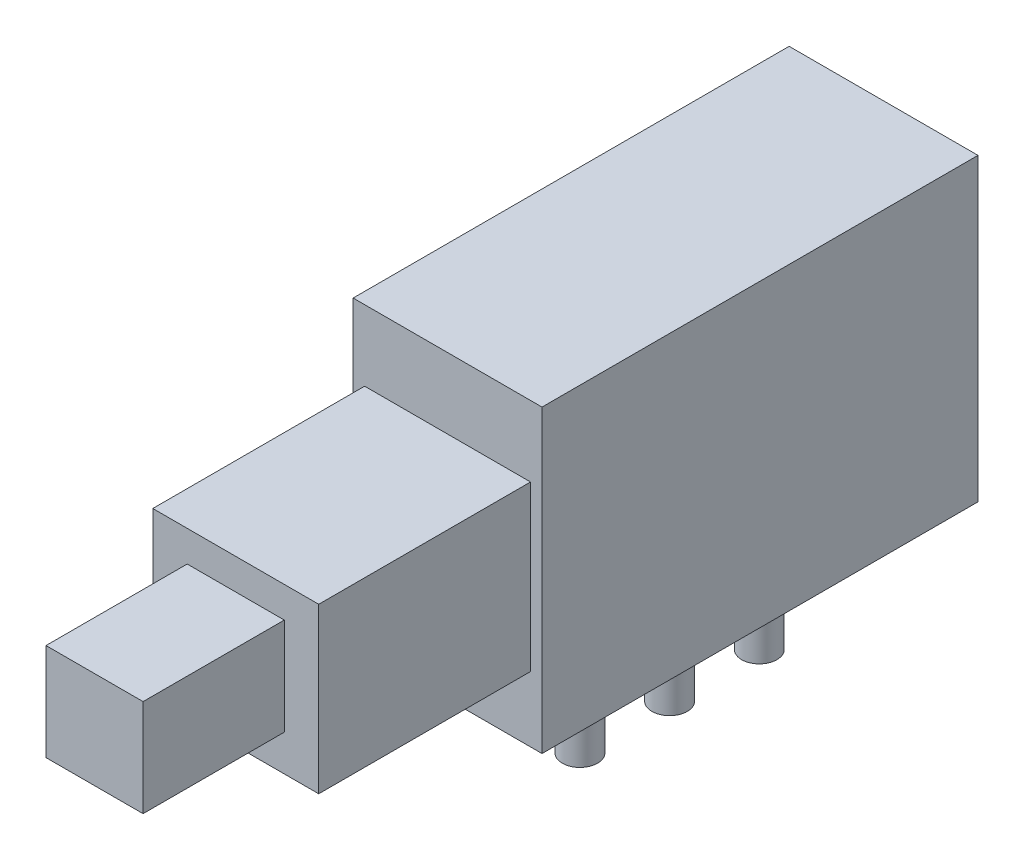
ISO-10303-21;
HEADER;
FILE_DESCRIPTION(('STEP AP214'),'2;1');
FILE_NAME('part.step','',(''),(''),'','','');
FILE_SCHEMA(('AUTOMOTIVE_DESIGN { 1 0 10303 214 1 1 1 1 }'));
ENDSEC;
DATA;
#1=APPLICATION_CONTEXT('core data for automotive mechanical design processes');
#2=APPLICATION_PROTOCOL_DEFINITION('international standard','automotive_design',2000,#1);
#3=PRODUCT_CONTEXT('',#1,'mechanical');
#4=PRODUCT('Part','Part','',(#3));
#5=PRODUCT_RELATED_PRODUCT_CATEGORY('part','',(#4));
#6=PRODUCT_DEFINITION_FORMATION('','',#4);
#7=PRODUCT_DEFINITION_CONTEXT('part definition',#1,'design');
#8=PRODUCT_DEFINITION('design','',#6,#7);
#9=PRODUCT_DEFINITION_SHAPE('','',#8);
#10=(LENGTH_UNIT() NAMED_UNIT(*) SI_UNIT(.MILLI.,.METRE.));
#11=(NAMED_UNIT(*) PLANE_ANGLE_UNIT() SI_UNIT($,.RADIAN.));
#12=(NAMED_UNIT(*) SI_UNIT($,.STERADIAN.) SOLID_ANGLE_UNIT());
#13=UNCERTAINTY_MEASURE_WITH_UNIT(LENGTH_MEASURE(1.E-05),#10,'distance_accuracy_value','');
#14=(GEOMETRIC_REPRESENTATION_CONTEXT(3) GLOBAL_UNCERTAINTY_ASSIGNED_CONTEXT((#13)) GLOBAL_UNIT_ASSIGNED_CONTEXT((#10,
#11,#12)) REPRESENTATION_CONTEXT('',''));
#15=CARTESIAN_POINT('',(0.,0.,0.));
#16=DIRECTION('',(0.,0.,1.));
#17=DIRECTION('',(1.,0.,0.));
#18=AXIS2_PLACEMENT_3D('',#15,#16,#17);
#19=CARTESIAN_POINT('',(0.,0.,12.35));
#20=DIRECTION('',(0.,0.,-1.));
#21=DIRECTION('',(-1.,0.,0.));
#22=AXIS2_PLACEMENT_3D('',#19,#20,#21);
#23=PLANE('',#22);
#24=DIRECTION('',(0.,1.,0.));
#25=VECTOR('',#24,1.);
#26=CARTESIAN_POINT('',(-2.675,-4.25,12.35));
#27=LINE('',#26,#25);
#28=CARTESIAN_POINT('',(-2.675,-4.25,12.35));
#29=VERTEX_POINT('',#28);
#30=CARTESIAN_POINT('',(-2.675,4.25,12.35));
#31=VERTEX_POINT('',#30);
#32=EDGE_CURVE('E180',#29,#31,#27,.T.);
#33=ORIENTED_EDGE('',*,*,#32,.F.);
#34=DIRECTION('',(1.,0.,0.));
#35=VECTOR('',#34,1.);
#36=CARTESIAN_POINT('',(-2.675,-4.25,12.35));
#37=LINE('',#36,#35);
#38=CARTESIAN_POINT('',(2.675,-4.25,12.35));
#39=VERTEX_POINT('',#38);
#40=EDGE_CURVE('E189',#29,#39,#37,.T.);
#41=ORIENTED_EDGE('',*,*,#40,.T.);
#42=DIRECTION('',(0.,1.,0.));
#43=VECTOR('',#42,1.);
#44=CARTESIAN_POINT('',(2.675,-4.25,12.35));
#45=LINE('',#44,#43);
#46=CARTESIAN_POINT('',(2.675,4.25,12.35));
#47=VERTEX_POINT('',#46);
#48=EDGE_CURVE('E187',#39,#47,#45,.T.);
#49=ORIENTED_EDGE('',*,*,#48,.T.);
#50=DIRECTION('',(1.,0.,0.));
#51=VECTOR('',#50,1.);
#52=CARTESIAN_POINT('',(-2.675,4.25,12.35));
#53=LINE('',#52,#51);
#54=EDGE_CURVE('E183',#31,#47,#53,.T.);
#55=ORIENTED_EDGE('',*,*,#54,.F.);
#56=EDGE_LOOP('',(#33,#41,#49,#55));
#57=FACE_BOUND('',#56,.T.);
#58=DIRECTION('',(0.,-1.,0.));
#59=VECTOR('',#58,1.);
#60=CARTESIAN_POINT('',(-2.35,2.25,12.35));
#61=LINE('',#60,#59);
#62=CARTESIAN_POINT('',(-2.35,2.25,12.35));
#63=VERTEX_POINT('',#62);
#64=CARTESIAN_POINT('',(-2.35,-2.4,12.35));
#65=VERTEX_POINT('',#64);
#66=EDGE_CURVE('E147',#63,#65,#61,.T.);
#67=ORIENTED_EDGE('',*,*,#66,.F.);
#68=DIRECTION('',(1.,0.,0.));
#69=VECTOR('',#68,1.);
#70=CARTESIAN_POINT('',(-2.35,2.25,12.35));
#71=LINE('',#70,#69);
#72=CARTESIAN_POINT('',(2.35,2.25,12.35));
#73=VERTEX_POINT('',#72);
#74=EDGE_CURVE('E143',#63,#73,#71,.T.);
#75=ORIENTED_EDGE('',*,*,#74,.T.);
#76=DIRECTION('',(0.,-1.,0.));
#77=VECTOR('',#76,1.);
#78=CARTESIAN_POINT('',(2.35,2.25,12.35));
#79=LINE('',#78,#77);
#80=CARTESIAN_POINT('',(2.35,-2.4,12.35));
#81=VERTEX_POINT('',#80);
#82=EDGE_CURVE('E49',#73,#81,#79,.T.);
#83=ORIENTED_EDGE('',*,*,#82,.T.);
#84=DIRECTION('',(1.,0.,0.));
#85=VECTOR('',#84,1.);
#86=CARTESIAN_POINT('',(-2.35,-2.4,12.35));
#87=LINE('',#86,#85);
#88=EDGE_CURVE('E456',#65,#81,#87,.T.);
#89=ORIENTED_EDGE('',*,*,#88,.F.);
#90=EDGE_LOOP('',(#67,#75,#83,#89));
#91=FACE_BOUND('',#90,.T.);
#92=ADVANCED_FACE('F34',(#57,#91),#23,.F.);
#93=CARTESIAN_POINT('',(-2.675,-4.25,12.35));
#94=DIRECTION('',(-1.,0.,0.));
#95=DIRECTION('',(0.,0.,1.));
#96=AXIS2_PLACEMENT_3D('',#93,#94,#95);
#97=PLANE('',#96);
#98=DIRECTION('',(0.,1.,0.));
#99=VECTOR('',#98,1.);
#100=CARTESIAN_POINT('',(-2.675,-4.25,0.));
#101=LINE('',#100,#99);
#102=CARTESIAN_POINT('',(-2.675,-4.25,0.));
#103=VERTEX_POINT('',#102);
#104=CARTESIAN_POINT('',(-2.675,4.25,0.));
#105=VERTEX_POINT('',#104);
#106=EDGE_CURVE('E173',#103,#105,#101,.T.);
#107=ORIENTED_EDGE('',*,*,#106,.F.);
#108=DIRECTION('',(0.,0.,-1.));
#109=VECTOR('',#108,1.);
#110=CARTESIAN_POINT('',(-2.675,-4.25,12.35));
#111=LINE('',#110,#109);
#112=EDGE_CURVE('E201',#29,#103,#111,.T.);
#113=ORIENTED_EDGE('',*,*,#112,.F.);
#114=ORIENTED_EDGE('',*,*,#32,.T.);
#115=DIRECTION('',(0.,0.,-1.));
#116=VECTOR('',#115,1.);
#117=CARTESIAN_POINT('',(-2.675,4.25,12.35));
#118=LINE('',#117,#116);
#119=EDGE_CURVE('E191',#31,#105,#118,.T.);
#120=ORIENTED_EDGE('',*,*,#119,.T.);
#121=EDGE_LOOP('',(#107,#113,#114,#120));
#122=FACE_BOUND('',#121,.T.);
#123=ADVANCED_FACE('F36',(#122),#97,.T.);
#124=CARTESIAN_POINT('',(-2.675,-4.25,12.35));
#125=DIRECTION('',(0.,1.,0.));
#126=DIRECTION('',(0.,0.,1.));
#127=AXIS2_PLACEMENT_3D('',#124,#125,#126);
#128=PLANE('',#127);
#129=CARTESIAN_POINT('',(0.,-4.25,3.52));
#130=DIRECTION('',(0.,1.,0.));
#131=DIRECTION('',(0.,0.,1.));
#132=AXIS2_PLACEMENT_3D('',#129,#130,#131);
#133=CIRCLE('',#132,0.500000000000001);
#134=CARTESIAN_POINT('',(0.,-4.25,4.02));
#135=VERTEX_POINT('',#134);
#136=EDGE_CURVE('E11',#135,#135,#133,.F.);
#137=ORIENTED_EDGE('',*,*,#136,.F.);
#138=EDGE_LOOP('',(#137));
#139=FACE_BOUND('',#138,.T.);
#140=CARTESIAN_POINT('',(0.,-4.25,6.06));
#141=DIRECTION('',(0.,1.,0.));
#142=DIRECTION('',(0.,0.,1.));
#143=AXIS2_PLACEMENT_3D('',#140,#141,#142);
#144=CIRCLE('',#143,0.500000000000001);
#145=CARTESIAN_POINT('',(0.,-4.25,6.56));
#146=VERTEX_POINT('',#145);
#147=EDGE_CURVE('E42',#146,#146,#144,.F.);
#148=ORIENTED_EDGE('',*,*,#147,.F.);
#149=EDGE_LOOP('',(#148));
#150=FACE_BOUND('',#149,.T.);
#151=CARTESIAN_POINT('',(0.,-4.25,8.6));
#152=DIRECTION('',(0.,1.,0.));
#153=DIRECTION('',(0.,0.,1.));
#154=AXIS2_PLACEMENT_3D('',#151,#152,#153);
#155=CIRCLE('',#154,0.500000000000001);
#156=CARTESIAN_POINT('',(0.,-4.25,9.1));
#157=VERTEX_POINT('',#156);
#158=EDGE_CURVE('E212',#157,#157,#155,.F.);
#159=ORIENTED_EDGE('',*,*,#158,.F.);
#160=EDGE_LOOP('',(#159));
#161=FACE_BOUND('',#160,.T.);
#162=DIRECTION('',(1.,0.,0.));
#163=VECTOR('',#162,1.);
#164=CARTESIAN_POINT('',(-2.675,-4.25,0.));
#165=LINE('',#164,#163);
#166=CARTESIAN_POINT('',(2.675,-4.25,0.));
#167=VERTEX_POINT('',#166);
#168=EDGE_CURVE('E184',#103,#167,#165,.T.);
#169=ORIENTED_EDGE('',*,*,#168,.T.);
#170=DIRECTION('',(0.,0.,-1.));
#171=VECTOR('',#170,1.);
#172=CARTESIAN_POINT('',(2.675,-4.25,12.35));
#173=LINE('',#172,#171);
#174=EDGE_CURVE('E204',#39,#167,#173,.T.);
#175=ORIENTED_EDGE('',*,*,#174,.F.);
#176=ORIENTED_EDGE('',*,*,#40,.F.);
#177=ORIENTED_EDGE('',*,*,#112,.T.);
#178=EDGE_LOOP('',(#169,#175,#176,#177));
#179=FACE_BOUND('',#178,.T.);
#180=ADVANCED_FACE('F219',(#139,#150,#161,#179),#128,.F.);
#181=CARTESIAN_POINT('',(2.675,-4.25,12.35));
#182=DIRECTION('',(-1.,0.,0.));
#183=DIRECTION('',(0.,0.,1.));
#184=AXIS2_PLACEMENT_3D('',#181,#182,#183);
#185=PLANE('',#184);
#186=DIRECTION('',(0.,1.,0.));
#187=VECTOR('',#186,1.);
#188=CARTESIAN_POINT('',(2.675,-4.25,0.));
#189=LINE('',#188,#187);
#190=CARTESIAN_POINT('',(2.675,4.25,0.));
#191=VERTEX_POINT('',#190);
#192=EDGE_CURVE('E197',#167,#191,#189,.T.);
#193=ORIENTED_EDGE('',*,*,#192,.T.);
#194=DIRECTION('',(0.,0.,-1.));
#195=VECTOR('',#194,1.);
#196=CARTESIAN_POINT('',(2.675,4.25,12.35));
#197=LINE('',#196,#195);
#198=EDGE_CURVE('E207',#47,#191,#197,.T.);
#199=ORIENTED_EDGE('',*,*,#198,.F.);
#200=ORIENTED_EDGE('',*,*,#48,.F.);
#201=ORIENTED_EDGE('',*,*,#174,.T.);
#202=EDGE_LOOP('',(#193,#199,#200,#201));
#203=FACE_BOUND('',#202,.T.);
#204=ADVANCED_FACE('F222',(#203),#185,.F.);
#205=CARTESIAN_POINT('',(-2.675,4.25,12.35));
#206=DIRECTION('',(0.,1.,0.));
#207=DIRECTION('',(0.,0.,1.));
#208=AXIS2_PLACEMENT_3D('',#205,#206,#207);
#209=PLANE('',#208);
#210=DIRECTION('',(1.,0.,0.));
#211=VECTOR('',#210,1.);
#212=CARTESIAN_POINT('',(-2.675,4.25,0.));
#213=LINE('',#212,#211);
#214=EDGE_CURVE('E194',#105,#191,#213,.T.);
#215=ORIENTED_EDGE('',*,*,#214,.F.);
#216=ORIENTED_EDGE('',*,*,#119,.F.);
#217=ORIENTED_EDGE('',*,*,#54,.T.);
#218=ORIENTED_EDGE('',*,*,#198,.T.);
#219=EDGE_LOOP('',(#215,#216,#217,#218));
#220=FACE_BOUND('',#219,.T.);
#221=ADVANCED_FACE('F239',(#220),#209,.T.);
#222=CARTESIAN_POINT('',(0.,0.,0.));
#223=DIRECTION('',(0.,0.,-1.));
#224=DIRECTION('',(-1.,0.,0.));
#225=AXIS2_PLACEMENT_3D('',#222,#223,#224);
#226=PLANE('',#225);
#227=ORIENTED_EDGE('',*,*,#106,.T.);
#228=ORIENTED_EDGE('',*,*,#214,.T.);
#229=ORIENTED_EDGE('',*,*,#192,.F.);
#230=ORIENTED_EDGE('',*,*,#168,.F.);
#231=EDGE_LOOP('',(#227,#228,#229,#230));
#232=FACE_BOUND('',#231,.T.);
#233=ADVANCED_FACE('F236',(#232),#226,.T.);
#234=CARTESIAN_POINT('',(-2.35,2.25,18.35));
#235=DIRECTION('',(1.,0.,0.));
#236=DIRECTION('',(0.,1.,0.));
#237=AXIS2_PLACEMENT_3D('',#234,#235,#236);
#238=PLANE('',#237);
#239=ORIENTED_EDGE('',*,*,#66,.T.);
#240=DIRECTION('',(0.,0.,-1.));
#241=VECTOR('',#240,1.);
#242=CARTESIAN_POINT('',(-2.35,-2.4,18.35));
#243=LINE('',#242,#241);
#244=CARTESIAN_POINT('',(-2.35,-2.4,18.35));
#245=VERTEX_POINT('',#244);
#246=EDGE_CURVE('E128',#245,#65,#243,.T.);
#247=ORIENTED_EDGE('',*,*,#246,.F.);
#248=DIRECTION('',(0.,-1.,0.));
#249=VECTOR('',#248,1.);
#250=CARTESIAN_POINT('',(-2.35,2.25,18.35));
#251=LINE('',#250,#249);
#252=CARTESIAN_POINT('',(-2.35,2.25,18.35));
#253=VERTEX_POINT('',#252);
#254=EDGE_CURVE('E135',#253,#245,#251,.T.);
#255=ORIENTED_EDGE('',*,*,#254,.F.);
#256=DIRECTION('',(0.,0.,-1.));
#257=VECTOR('',#256,1.);
#258=CARTESIAN_POINT('',(-2.35,2.25,18.35));
#259=LINE('',#258,#257);
#260=EDGE_CURVE('E454',#253,#63,#259,.T.);
#261=ORIENTED_EDGE('',*,*,#260,.T.);
#262=EDGE_LOOP('',(#239,#247,#255,#261));
#263=FACE_BOUND('',#262,.T.);
#264=ADVANCED_FACE('F145',(#263),#238,.F.);
#265=CARTESIAN_POINT('',(-2.35,-2.4,18.35));
#266=DIRECTION('',(0.,1.,0.));
#267=DIRECTION('',(-1.,0.,0.));
#268=AXIS2_PLACEMENT_3D('',#265,#266,#267);
#269=PLANE('',#268);
#270=ORIENTED_EDGE('',*,*,#88,.T.);
#271=DIRECTION('',(0.,0.,-1.));
#272=VECTOR('',#271,1.);
#273=CARTESIAN_POINT('',(2.35,-2.4,18.35));
#274=LINE('',#273,#272);
#275=CARTESIAN_POINT('',(2.35,-2.4,18.35));
#276=VERTEX_POINT('',#275);
#277=EDGE_CURVE('E130',#276,#81,#274,.T.);
#278=ORIENTED_EDGE('',*,*,#277,.F.);
#279=DIRECTION('',(1.,0.,0.));
#280=VECTOR('',#279,1.);
#281=CARTESIAN_POINT('',(-2.35,-2.4,18.35));
#282=LINE('',#281,#280);
#283=EDGE_CURVE('E123',#245,#276,#282,.T.);
#284=ORIENTED_EDGE('',*,*,#283,.F.);
#285=ORIENTED_EDGE('',*,*,#246,.T.);
#286=EDGE_LOOP('',(#270,#278,#284,#285));
#287=FACE_BOUND('',#286,.T.);
#288=ADVANCED_FACE('F126',(#287),#269,.F.);
#289=CARTESIAN_POINT('',(2.35,2.25,18.35));
#290=DIRECTION('',(1.,0.,0.));
#291=DIRECTION('',(0.,0.,-1.));
#292=AXIS2_PLACEMENT_3D('',#289,#290,#291);
#293=PLANE('',#292);
#294=ORIENTED_EDGE('',*,*,#82,.F.);
#295=DIRECTION('',(0.,0.,-1.));
#296=VECTOR('',#295,1.);
#297=CARTESIAN_POINT('',(2.35,2.25,18.35));
#298=LINE('',#297,#296);
#299=CARTESIAN_POINT('',(2.35,2.25,18.35));
#300=VERTEX_POINT('',#299);
#301=EDGE_CURVE('E154',#300,#73,#298,.T.);
#302=ORIENTED_EDGE('',*,*,#301,.F.);
#303=DIRECTION('',(0.,-1.,0.));
#304=VECTOR('',#303,1.);
#305=CARTESIAN_POINT('',(2.35,2.25,18.35));
#306=LINE('',#305,#304);
#307=EDGE_CURVE('E134',#300,#276,#306,.T.);
#308=ORIENTED_EDGE('',*,*,#307,.T.);
#309=ORIENTED_EDGE('',*,*,#277,.T.);
#310=EDGE_LOOP('',(#294,#302,#308,#309));
#311=FACE_BOUND('',#310,.T.);
#312=ADVANCED_FACE('F281',(#311),#293,.T.);
#313=CARTESIAN_POINT('',(-2.35,2.25,18.35));
#314=DIRECTION('',(0.,1.,0.));
#315=DIRECTION('',(-1.,0.,0.));
#316=AXIS2_PLACEMENT_3D('',#313,#314,#315);
#317=PLANE('',#316);
#318=ORIENTED_EDGE('',*,*,#74,.F.);
#319=ORIENTED_EDGE('',*,*,#260,.F.);
#320=DIRECTION('',(1.,0.,0.));
#321=VECTOR('',#320,1.);
#322=CARTESIAN_POINT('',(-2.35,2.25,18.35));
#323=LINE('',#322,#321);
#324=EDGE_CURVE('E141',#253,#300,#323,.T.);
#325=ORIENTED_EDGE('',*,*,#324,.T.);
#326=ORIENTED_EDGE('',*,*,#301,.T.);
#327=EDGE_LOOP('',(#318,#319,#325,#326));
#328=FACE_BOUND('',#327,.T.);
#329=ADVANCED_FACE('F288',(#328),#317,.T.);
#330=CARTESIAN_POINT('',(0.,0.,18.35));
#331=DIRECTION('',(0.,0.,1.));
#332=DIRECTION('',(1.,0.,0.));
#333=AXIS2_PLACEMENT_3D('',#330,#331,#332);
#334=PLANE('',#333);
#335=DIRECTION('',(1.,0.,0.));
#336=VECTOR('',#335,1.);
#337=CARTESIAN_POINT('',(-1.375,-1.375,18.35));
#338=LINE('',#337,#336);
#339=CARTESIAN_POINT('',(-1.375,-1.375,18.35));
#340=VERTEX_POINT('',#339);
#341=CARTESIAN_POINT('',(1.375,-1.375,18.35));
#342=VERTEX_POINT('',#341);
#343=EDGE_CURVE('E152',#340,#342,#338,.T.);
#344=ORIENTED_EDGE('',*,*,#343,.F.);
#345=DIRECTION('',(0.,1.,0.));
#346=VECTOR('',#345,1.);
#347=CARTESIAN_POINT('',(-1.375,-1.375,18.35));
#348=LINE('',#347,#346);
#349=CARTESIAN_POINT('',(-1.375,1.375,18.35));
#350=VERTEX_POINT('',#349);
#351=EDGE_CURVE('E57',#340,#350,#348,.T.);
#352=ORIENTED_EDGE('',*,*,#351,.T.);
#353=DIRECTION('',(1.,0.,0.));
#354=VECTOR('',#353,1.);
#355=CARTESIAN_POINT('',(-1.375,1.375,18.35));
#356=LINE('',#355,#354);
#357=CARTESIAN_POINT('',(1.375,1.375,18.35));
#358=VERTEX_POINT('',#357);
#359=EDGE_CURVE('E203',#350,#358,#356,.T.);
#360=ORIENTED_EDGE('',*,*,#359,.T.);
#361=DIRECTION('',(0.,1.,0.));
#362=VECTOR('',#361,1.);
#363=CARTESIAN_POINT('',(1.375,-1.375,18.35));
#364=LINE('',#363,#362);
#365=EDGE_CURVE('E149',#342,#358,#364,.T.);
#366=ORIENTED_EDGE('',*,*,#365,.F.);
#367=EDGE_LOOP('',(#344,#352,#360,#366));
#368=FACE_BOUND('',#367,.T.);
#369=ORIENTED_EDGE('',*,*,#254,.T.);
#370=ORIENTED_EDGE('',*,*,#283,.T.);
#371=ORIENTED_EDGE('',*,*,#307,.F.);
#372=ORIENTED_EDGE('',*,*,#324,.F.);
#373=EDGE_LOOP('',(#369,#370,#371,#372));
#374=FACE_BOUND('',#373,.T.);
#375=ADVANCED_FACE('F139',(#368,#374),#334,.T.);
#376=CARTESIAN_POINT('',(0.,0.,22.35));
#377=DIRECTION('',(0.,0.,-1.));
#378=DIRECTION('',(-1.,0.,0.));
#379=AXIS2_PLACEMENT_3D('',#376,#377,#378);
#380=PLANE('',#379);
#381=DIRECTION('',(0.,1.,0.));
#382=VECTOR('',#381,1.);
#383=CARTESIAN_POINT('',(-1.375,-1.375,22.35));
#384=LINE('',#383,#382);
#385=CARTESIAN_POINT('',(-1.375,-1.375,22.35));
#386=VERTEX_POINT('',#385);
#387=CARTESIAN_POINT('',(-1.375,1.375,22.35));
#388=VERTEX_POINT('',#387);
#389=EDGE_CURVE('E160',#386,#388,#384,.T.);
#390=ORIENTED_EDGE('',*,*,#389,.F.);
#391=DIRECTION('',(1.,0.,0.));
#392=VECTOR('',#391,1.);
#393=CARTESIAN_POINT('',(-1.375,-1.375,22.35));
#394=LINE('',#393,#392);
#395=CARTESIAN_POINT('',(1.375,-1.375,22.35));
#396=VERTEX_POINT('',#395);
#397=EDGE_CURVE('E168',#386,#396,#394,.T.);
#398=ORIENTED_EDGE('',*,*,#397,.T.);
#399=DIRECTION('',(0.,1.,0.));
#400=VECTOR('',#399,1.);
#401=CARTESIAN_POINT('',(1.375,-1.375,22.35));
#402=LINE('',#401,#400);
#403=CARTESIAN_POINT('',(1.375,1.375,22.35));
#404=VERTEX_POINT('',#403);
#405=EDGE_CURVE('E166',#396,#404,#402,.T.);
#406=ORIENTED_EDGE('',*,*,#405,.T.);
#407=DIRECTION('',(1.,0.,0.));
#408=VECTOR('',#407,1.);
#409=CARTESIAN_POINT('',(-1.375,1.375,22.35));
#410=LINE('',#409,#408);
#411=EDGE_CURVE('E163',#388,#404,#410,.T.);
#412=ORIENTED_EDGE('',*,*,#411,.F.);
#413=EDGE_LOOP('',(#390,#398,#406,#412));
#414=FACE_BOUND('',#413,.T.);
#415=ADVANCED_FACE('F302',(#414),#380,.F.);
#416=CARTESIAN_POINT('',(-1.375,1.375,22.35));
#417=DIRECTION('',(0.,1.,0.));
#418=DIRECTION('',(0.,0.,1.));
#419=AXIS2_PLACEMENT_3D('',#416,#417,#418);
#420=PLANE('',#419);
#421=ORIENTED_EDGE('',*,*,#359,.F.);
#422=DIRECTION('',(0.,0.,-1.));
#423=VECTOR('',#422,1.);
#424=CARTESIAN_POINT('',(-1.375,1.375,22.35));
#425=LINE('',#424,#423);
#426=EDGE_CURVE('E170',#388,#350,#425,.T.);
#427=ORIENTED_EDGE('',*,*,#426,.F.);
#428=ORIENTED_EDGE('',*,*,#411,.T.);
#429=DIRECTION('',(0.,0.,-1.));
#430=VECTOR('',#429,1.);
#431=CARTESIAN_POINT('',(1.375,1.375,22.35));
#432=LINE('',#431,#430);
#433=EDGE_CURVE('E177',#404,#358,#432,.T.);
#434=ORIENTED_EDGE('',*,*,#433,.T.);
#435=EDGE_LOOP('',(#421,#427,#428,#434));
#436=FACE_BOUND('',#435,.T.);
#437=ADVANCED_FACE('F310',(#436),#420,.T.);
#438=CARTESIAN_POINT('',(1.375,-1.375,22.35));
#439=DIRECTION('',(-1.,0.,0.));
#440=DIRECTION('',(0.,0.,1.));
#441=AXIS2_PLACEMENT_3D('',#438,#439,#440);
#442=PLANE('',#441);
#443=DIRECTION('',(0.,0.,-1.));
#444=VECTOR('',#443,1.);
#445=CARTESIAN_POINT('',(1.375,-1.375,22.35));
#446=LINE('',#445,#444);
#447=EDGE_CURVE('E174',#396,#342,#446,.T.);
#448=ORIENTED_EDGE('',*,*,#447,.T.);
#449=ORIENTED_EDGE('',*,*,#365,.T.);
#450=ORIENTED_EDGE('',*,*,#433,.F.);
#451=ORIENTED_EDGE('',*,*,#405,.F.);
#452=EDGE_LOOP('',(#448,#449,#450,#451));
#453=FACE_BOUND('',#452,.T.);
#454=ADVANCED_FACE('F317',(#453),#442,.F.);
#455=CARTESIAN_POINT('',(-1.375,-1.375,22.35));
#456=DIRECTION('',(0.,1.,0.));
#457=DIRECTION('',(0.,0.,1.));
#458=AXIS2_PLACEMENT_3D('',#455,#456,#457);
#459=PLANE('',#458);
#460=DIRECTION('',(0.,0.,-1.));
#461=VECTOR('',#460,1.);
#462=CARTESIAN_POINT('',(-1.375,-1.375,22.35));
#463=LINE('',#462,#461);
#464=EDGE_CURVE('E171',#386,#340,#463,.T.);
#465=ORIENTED_EDGE('',*,*,#464,.T.);
#466=ORIENTED_EDGE('',*,*,#343,.T.);
#467=ORIENTED_EDGE('',*,*,#447,.F.);
#468=ORIENTED_EDGE('',*,*,#397,.F.);
#469=EDGE_LOOP('',(#465,#466,#467,#468));
#470=FACE_BOUND('',#469,.T.);
#471=ADVANCED_FACE('F324',(#470),#459,.F.);
#472=CARTESIAN_POINT('',(-1.375,-1.375,22.35));
#473=DIRECTION('',(-1.,0.,0.));
#474=DIRECTION('',(0.,0.,1.));
#475=AXIS2_PLACEMENT_3D('',#472,#473,#474);
#476=PLANE('',#475);
#477=ORIENTED_EDGE('',*,*,#351,.F.);
#478=ORIENTED_EDGE('',*,*,#464,.F.);
#479=ORIENTED_EDGE('',*,*,#389,.T.);
#480=ORIENTED_EDGE('',*,*,#426,.T.);
#481=EDGE_LOOP('',(#477,#478,#479,#480));
#482=FACE_BOUND('',#481,.T.);
#483=ADVANCED_FACE('F254',(#482),#476,.T.);
#484=CARTESIAN_POINT('',(0.,-7.45,8.6));
#485=DIRECTION('',(0.,1.,0.));
#486=DIRECTION('',(0.,0.,1.));
#487=AXIS2_PLACEMENT_3D('',#484,#485,#486);
#488=CYLINDRICAL_SURFACE('',#487,0.500000000000001);
#489=CARTESIAN_POINT('',(0.,-7.45,8.6));
#490=DIRECTION('',(0.,-1.,0.));
#491=DIRECTION('',(0.,0.,-1.));
#492=AXIS2_PLACEMENT_3D('',#489,#490,#491);
#493=CIRCLE('',#492,0.500000000000001);
#494=CARTESIAN_POINT('',(0.,-7.45,8.1));
#495=VERTEX_POINT('',#494);
#496=EDGE_CURVE('E447',#495,#495,#493,.T.);
#497=ORIENTED_EDGE('',*,*,#496,.F.);
#498=EDGE_LOOP('',(#497));
#499=FACE_BOUND('',#498,.T.);
#500=ORIENTED_EDGE('',*,*,#158,.T.);
#501=EDGE_LOOP('',(#500));
#502=FACE_BOUND('',#501,.T.);
#503=ADVANCED_FACE('F339',(#499,#502),#488,.T.);
#504=CARTESIAN_POINT('',(0.,-7.45,8.6));
#505=DIRECTION('',(0.,-1.,0.));
#506=DIRECTION('',(0.,0.,-1.));
#507=AXIS2_PLACEMENT_3D('',#504,#505,#506);
#508=PLANE('',#507);
#509=ORIENTED_EDGE('',*,*,#496,.T.);
#510=EDGE_LOOP('',(#509));
#511=FACE_BOUND('',#510,.T.);
#512=ADVANCED_FACE('F346',(#511),#508,.T.);
#513=CARTESIAN_POINT('',(0.,-7.45,6.06));
#514=DIRECTION('',(0.,1.,0.));
#515=DIRECTION('',(0.,0.,1.));
#516=AXIS2_PLACEMENT_3D('',#513,#514,#515);
#517=CYLINDRICAL_SURFACE('',#516,0.500000000000001);
#518=CARTESIAN_POINT('',(0.,-7.45,6.06));
#519=DIRECTION('',(0.,-1.,0.));
#520=DIRECTION('',(0.,0.,-1.));
#521=AXIS2_PLACEMENT_3D('',#518,#519,#520);
#522=CIRCLE('',#521,0.500000000000001);
#523=CARTESIAN_POINT('',(0.,-7.45,5.56));
#524=VERTEX_POINT('',#523);
#525=EDGE_CURVE('E444',#524,#524,#522,.T.);
#526=ORIENTED_EDGE('',*,*,#525,.F.);
#527=EDGE_LOOP('',(#526));
#528=FACE_BOUND('',#527,.T.);
#529=ORIENTED_EDGE('',*,*,#147,.T.);
#530=EDGE_LOOP('',(#529));
#531=FACE_BOUND('',#530,.T.);
#532=ADVANCED_FACE('F217',(#528,#531),#517,.T.);
#533=CARTESIAN_POINT('',(0.,-7.45,6.06));
#534=DIRECTION('',(0.,-1.,0.));
#535=DIRECTION('',(0.,0.,-1.));
#536=AXIS2_PLACEMENT_3D('',#533,#534,#535);
#537=PLANE('',#536);
#538=ORIENTED_EDGE('',*,*,#525,.T.);
#539=EDGE_LOOP('',(#538));
#540=FACE_BOUND('',#539,.T.);
#541=ADVANCED_FACE('F361',(#540),#537,.T.);
#542=CARTESIAN_POINT('',(0.,-7.45,3.52));
#543=DIRECTION('',(0.,1.,0.));
#544=DIRECTION('',(0.,0.,1.));
#545=AXIS2_PLACEMENT_3D('',#542,#543,#544);
#546=CYLINDRICAL_SURFACE('',#545,0.500000000000001);
#547=CARTESIAN_POINT('',(0.,-7.45,3.52));
#548=DIRECTION('',(0.,-1.,0.));
#549=DIRECTION('',(0.,0.,-1.));
#550=AXIS2_PLACEMENT_3D('',#547,#548,#549);
#551=CIRCLE('',#550,0.500000000000001);
#552=CARTESIAN_POINT('',(0.,-7.45,3.02));
#553=VERTEX_POINT('',#552);
#554=EDGE_CURVE('E443',#553,#553,#551,.T.);
#555=ORIENTED_EDGE('',*,*,#554,.F.);
#556=EDGE_LOOP('',(#555));
#557=FACE_BOUND('',#556,.T.);
#558=ORIENTED_EDGE('',*,*,#136,.T.);
#559=EDGE_LOOP('',(#558));
#560=FACE_BOUND('',#559,.T.);
#561=ADVANCED_FACE('F369',(#557,#560),#546,.T.);
#562=CARTESIAN_POINT('',(0.,-7.45,3.52));
#563=DIRECTION('',(0.,-1.,0.));
#564=DIRECTION('',(0.,0.,-1.));
#565=AXIS2_PLACEMENT_3D('',#562,#563,#564);
#566=PLANE('',#565);
#567=ORIENTED_EDGE('',*,*,#554,.T.);
#568=EDGE_LOOP('',(#567));
#569=FACE_BOUND('',#568,.T.);
#570=ADVANCED_FACE('F377',(#569),#566,.T.);
#571=CLOSED_SHELL('',(#92,#123,#180,#204,#221,#233,#264,#288,#312,#329,#375,#415,#437,#454,#471,
#483,#503,#512,#532,#541,#561,#570));
#572=MANIFOLD_SOLID_BREP('B2',#571);
#573=ADVANCED_BREP_SHAPE_REPRESENTATION('',(#18,#572),#14);
#574=SHAPE_DEFINITION_REPRESENTATION(#9,#573);
ENDSEC;
END-ISO-10303-21;
